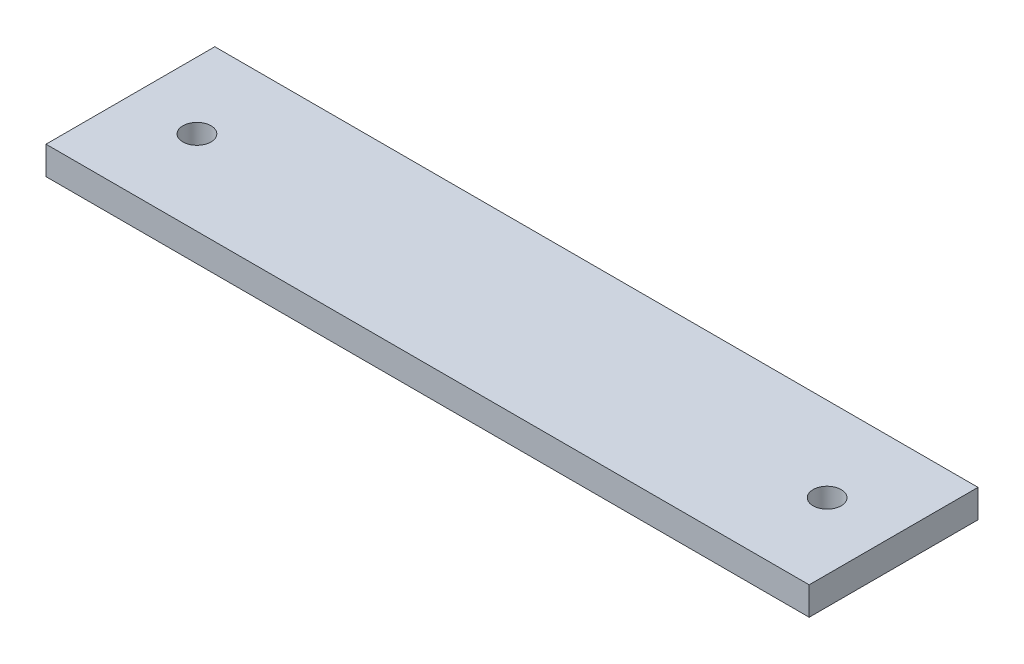
ISO-10303-21;
HEADER;
FILE_DESCRIPTION(('STEP AP214'),'2;1');
FILE_NAME('part.step','',(''),(''),'','','');
FILE_SCHEMA(('AUTOMOTIVE_DESIGN { 1 0 10303 214 1 1 1 1 }'));
ENDSEC;
DATA;
#1=APPLICATION_CONTEXT('core data for automotive mechanical design processes');
#2=APPLICATION_PROTOCOL_DEFINITION('international standard','automotive_design',2000,#1);
#3=PRODUCT_CONTEXT('',#1,'mechanical');
#4=PRODUCT('Part','Part','',(#3));
#5=PRODUCT_RELATED_PRODUCT_CATEGORY('part','',(#4));
#6=PRODUCT_DEFINITION_FORMATION('','',#4);
#7=PRODUCT_DEFINITION_CONTEXT('part definition',#1,'design');
#8=PRODUCT_DEFINITION('design','',#6,#7);
#9=PRODUCT_DEFINITION_SHAPE('','',#8);
#10=(LENGTH_UNIT() NAMED_UNIT(*) SI_UNIT(.MILLI.,.METRE.));
#11=(NAMED_UNIT(*) PLANE_ANGLE_UNIT() SI_UNIT($,.RADIAN.));
#12=(NAMED_UNIT(*) SI_UNIT($,.STERADIAN.) SOLID_ANGLE_UNIT());
#13=UNCERTAINTY_MEASURE_WITH_UNIT(LENGTH_MEASURE(1.E-05),#10,'distance_accuracy_value','');
#14=(GEOMETRIC_REPRESENTATION_CONTEXT(3) GLOBAL_UNCERTAINTY_ASSIGNED_CONTEXT((#13)) GLOBAL_UNIT_ASSIGNED_CONTEXT((#10,
#11,#12)) REPRESENTATION_CONTEXT('',''));
#15=CARTESIAN_POINT('',(0.,0.,0.));
#16=DIRECTION('',(0.,0.,1.));
#17=DIRECTION('',(1.,0.,0.));
#18=AXIS2_PLACEMENT_3D('',#15,#16,#17);
#19=CARTESIAN_POINT('',(86.11997,6.35,-19.05));
#20=DIRECTION('',(-1.,0.,0.));
#21=DIRECTION('',(0.,0.,1.));
#22=AXIS2_PLACEMENT_3D('',#19,#20,#21);
#23=PLANE('',#22);
#24=DIRECTION('',(0.,0.,-1.));
#25=VECTOR('',#24,1.);
#26=CARTESIAN_POINT('',(86.11997,0.,-19.05));
#27=LINE('',#26,#25);
#28=CARTESIAN_POINT('',(86.11997,0.,19.05));
#29=VERTEX_POINT('',#28);
#30=CARTESIAN_POINT('',(86.11997,0.,-19.05));
#31=VERTEX_POINT('',#30);
#32=EDGE_CURVE('E96',#29,#31,#27,.T.);
#33=ORIENTED_EDGE('',*,*,#32,.T.);
#34=DIRECTION('',(0.,-1.,0.));
#35=VECTOR('',#34,1.);
#36=CARTESIAN_POINT('',(86.11997,6.35,-19.05));
#37=LINE('',#36,#35);
#38=CARTESIAN_POINT('',(86.11997,6.35,-19.05));
#39=VERTEX_POINT('',#38);
#40=EDGE_CURVE('E11',#39,#31,#37,.T.);
#41=ORIENTED_EDGE('',*,*,#40,.F.);
#42=DIRECTION('',(0.,0.,-1.));
#43=VECTOR('',#42,1.);
#44=CARTESIAN_POINT('',(86.11997,6.35,-19.05));
#45=LINE('',#44,#43);
#46=CARTESIAN_POINT('',(86.11997,6.35,19.05));
#47=VERTEX_POINT('',#46);
#48=EDGE_CURVE('E84',#47,#39,#45,.T.);
#49=ORIENTED_EDGE('',*,*,#48,.F.);
#50=DIRECTION('',(0.,-1.,0.));
#51=VECTOR('',#50,1.);
#52=CARTESIAN_POINT('',(86.11997,6.35,19.05));
#53=LINE('',#52,#51);
#54=EDGE_CURVE('E92',#47,#29,#53,.T.);
#55=ORIENTED_EDGE('',*,*,#54,.T.);
#56=EDGE_LOOP('',(#33,#41,#49,#55));
#57=FACE_BOUND('',#56,.T.);
#58=ADVANCED_FACE('F33',(#57),#23,.F.);
#59=CARTESIAN_POINT('',(-86.11997,6.35,-19.05));
#60=DIRECTION('',(0.,0.,1.));
#61=DIRECTION('',(1.,0.,0.));
#62=AXIS2_PLACEMENT_3D('',#59,#60,#61);
#63=PLANE('',#62);
#64=DIRECTION('',(-1.,0.,0.));
#65=VECTOR('',#64,1.);
#66=CARTESIAN_POINT('',(-86.11997,0.,-19.05));
#67=LINE('',#66,#65);
#68=CARTESIAN_POINT('',(-86.11997,0.,-19.05));
#69=VERTEX_POINT('',#68);
#70=EDGE_CURVE('E88',#31,#69,#67,.T.);
#71=ORIENTED_EDGE('',*,*,#70,.T.);
#72=DIRECTION('',(0.,-1.,0.));
#73=VECTOR('',#72,1.);
#74=CARTESIAN_POINT('',(-86.11997,6.35,-19.05));
#75=LINE('',#74,#73);
#76=CARTESIAN_POINT('',(-86.11997,6.35,-19.05));
#77=VERTEX_POINT('',#76);
#78=EDGE_CURVE('E41',#77,#69,#75,.T.);
#79=ORIENTED_EDGE('',*,*,#78,.F.);
#80=DIRECTION('',(-1.,0.,0.));
#81=VECTOR('',#80,1.);
#82=CARTESIAN_POINT('',(-86.11997,6.35,-19.05));
#83=LINE('',#82,#81);
#84=EDGE_CURVE('E79',#39,#77,#83,.T.);
#85=ORIENTED_EDGE('',*,*,#84,.F.);
#86=ORIENTED_EDGE('',*,*,#40,.T.);
#87=EDGE_LOOP('',(#71,#79,#85,#86));
#88=FACE_BOUND('',#87,.T.);
#89=ADVANCED_FACE('F87',(#88),#63,.F.);
#90=CARTESIAN_POINT('',(-86.11997,6.35,-19.05));
#91=DIRECTION('',(1.,0.,0.));
#92=DIRECTION('',(0.,0.,-1.));
#93=AXIS2_PLACEMENT_3D('',#90,#91,#92);
#94=PLANE('',#93);
#95=DIRECTION('',(0.,0.,1.));
#96=VECTOR('',#95,1.);
#97=CARTESIAN_POINT('',(-86.11997,0.,-19.05));
#98=LINE('',#97,#96);
#99=CARTESIAN_POINT('',(-86.11997,0.,19.05));
#100=VERTEX_POINT('',#99);
#101=EDGE_CURVE('E66',#69,#100,#98,.T.);
#102=ORIENTED_EDGE('',*,*,#101,.T.);
#103=DIRECTION('',(0.,-1.,0.));
#104=VECTOR('',#103,1.);
#105=CARTESIAN_POINT('',(-86.11997,6.35,19.05));
#106=LINE('',#105,#104);
#107=CARTESIAN_POINT('',(-86.11997,6.35,19.05));
#108=VERTEX_POINT('',#107);
#109=EDGE_CURVE('E89',#108,#100,#106,.T.);
#110=ORIENTED_EDGE('',*,*,#109,.F.);
#111=DIRECTION('',(0.,0.,1.));
#112=VECTOR('',#111,1.);
#113=CARTESIAN_POINT('',(-86.11997,6.35,-19.05));
#114=LINE('',#113,#112);
#115=EDGE_CURVE('E82',#77,#108,#114,.T.);
#116=ORIENTED_EDGE('',*,*,#115,.F.);
#117=ORIENTED_EDGE('',*,*,#78,.T.);
#118=EDGE_LOOP('',(#102,#110,#116,#117));
#119=FACE_BOUND('',#118,.T.);
#120=ADVANCED_FACE('F90',(#119),#94,.F.);
#121=CARTESIAN_POINT('',(-86.11997,6.35,19.05));
#122=DIRECTION('',(0.,0.,-1.));
#123=DIRECTION('',(-1.,0.,0.));
#124=AXIS2_PLACEMENT_3D('',#121,#122,#123);
#125=PLANE('',#124);
#126=DIRECTION('',(1.,0.,0.));
#127=VECTOR('',#126,1.);
#128=CARTESIAN_POINT('',(-86.11997,0.,19.05));
#129=LINE('',#128,#127);
#130=EDGE_CURVE('E72',#100,#29,#129,.T.);
#131=ORIENTED_EDGE('',*,*,#130,.T.);
#132=ORIENTED_EDGE('',*,*,#54,.F.);
#133=DIRECTION('',(1.,0.,0.));
#134=VECTOR('',#133,1.);
#135=CARTESIAN_POINT('',(-86.11997,6.35,19.05));
#136=LINE('',#135,#134);
#137=EDGE_CURVE('E49',#108,#47,#136,.T.);
#138=ORIENTED_EDGE('',*,*,#137,.F.);
#139=ORIENTED_EDGE('',*,*,#109,.T.);
#140=EDGE_LOOP('',(#131,#132,#138,#139));
#141=FACE_BOUND('',#140,.T.);
#142=ADVANCED_FACE('F104',(#141),#125,.F.);
#143=CARTESIAN_POINT('',(0.,6.35,0.));
#144=DIRECTION('',(0.,1.,0.));
#145=DIRECTION('',(0.,0.,1.));
#146=AXIS2_PLACEMENT_3D('',#143,#144,#145);
#147=PLANE('',#146);
#148=CARTESIAN_POINT('',(71.11997,6.35,0.));
#149=DIRECTION('',(0.,1.,0.));
#150=DIRECTION('',(0.,0.,1.));
#151=AXIS2_PLACEMENT_3D('',#148,#149,#150);
#152=CIRCLE('',#151,3.175);
#153=CARTESIAN_POINT('',(71.11997,6.35,3.175));
#154=VERTEX_POINT('',#153);
#155=EDGE_CURVE('E116',#154,#154,#152,.F.);
#156=ORIENTED_EDGE('',*,*,#155,.T.);
#157=EDGE_LOOP('',(#156));
#158=FACE_BOUND('',#157,.T.);
#159=CARTESIAN_POINT('',(-71.10857,6.35,0.));
#160=DIRECTION('',(0.,1.,0.));
#161=DIRECTION('',(0.,0.,1.));
#162=AXIS2_PLACEMENT_3D('',#159,#160,#161);
#163=CIRCLE('',#162,3.175);
#164=CARTESIAN_POINT('',(-71.10857,6.35,3.175));
#165=VERTEX_POINT('',#164);
#166=EDGE_CURVE('E110',#165,#165,#163,.F.);
#167=ORIENTED_EDGE('',*,*,#166,.T.);
#168=EDGE_LOOP('',(#167));
#169=FACE_BOUND('',#168,.T.);
#170=ORIENTED_EDGE('',*,*,#48,.T.);
#171=ORIENTED_EDGE('',*,*,#84,.T.);
#172=ORIENTED_EDGE('',*,*,#115,.T.);
#173=ORIENTED_EDGE('',*,*,#137,.T.);
#174=EDGE_LOOP('',(#170,#171,#172,#173));
#175=FACE_BOUND('',#174,.T.);
#176=ADVANCED_FACE('F80',(#158,#169,#175),#147,.T.);
#177=CARTESIAN_POINT('',(0.,0.,0.));
#178=DIRECTION('',(0.,1.,0.));
#179=DIRECTION('',(0.,0.,1.));
#180=AXIS2_PLACEMENT_3D('',#177,#178,#179);
#181=PLANE('',#180);
#182=CARTESIAN_POINT('',(71.11997,0.,0.));
#183=DIRECTION('',(0.,-1.,0.));
#184=DIRECTION('',(0.,0.,-1.));
#185=AXIS2_PLACEMENT_3D('',#182,#183,#184);
#186=CIRCLE('',#185,3.175);
#187=CARTESIAN_POINT('',(71.11997,0.,-3.175));
#188=VERTEX_POINT('',#187);
#189=EDGE_CURVE('E113',#188,#188,#186,.T.);
#190=ORIENTED_EDGE('',*,*,#189,.F.);
#191=EDGE_LOOP('',(#190));
#192=FACE_BOUND('',#191,.T.);
#193=CARTESIAN_POINT('',(-71.10857,0.,0.));
#194=DIRECTION('',(0.,-1.,0.));
#195=DIRECTION('',(0.,0.,-1.));
#196=AXIS2_PLACEMENT_3D('',#193,#194,#195);
#197=CIRCLE('',#196,3.175);
#198=CARTESIAN_POINT('',(-71.10857,0.,-3.175));
#199=VERTEX_POINT('',#198);
#200=EDGE_CURVE('E99',#199,#199,#197,.T.);
#201=ORIENTED_EDGE('',*,*,#200,.F.);
#202=EDGE_LOOP('',(#201));
#203=FACE_BOUND('',#202,.T.);
#204=ORIENTED_EDGE('',*,*,#32,.F.);
#205=ORIENTED_EDGE('',*,*,#130,.F.);
#206=ORIENTED_EDGE('',*,*,#101,.F.);
#207=ORIENTED_EDGE('',*,*,#70,.F.);
#208=EDGE_LOOP('',(#204,#205,#206,#207));
#209=FACE_BOUND('',#208,.T.);
#210=ADVANCED_FACE('F107',(#192,#203,#209),#181,.F.);
#211=CARTESIAN_POINT('',(-71.10857,6.351,0.));
#212=DIRECTION('',(0.,-1.,0.));
#213=DIRECTION('',(0.,0.,-1.));
#214=AXIS2_PLACEMENT_3D('',#211,#212,#213);
#215=CYLINDRICAL_SURFACE('',#214,3.175);
#216=ORIENTED_EDGE('',*,*,#166,.F.);
#217=EDGE_LOOP('',(#216));
#218=FACE_BOUND('',#217,.T.);
#219=ORIENTED_EDGE('',*,*,#200,.T.);
#220=EDGE_LOOP('',(#219));
#221=FACE_BOUND('',#220,.T.);
#222=ADVANCED_FACE('F126',(#218,#221),#215,.F.);
#223=CARTESIAN_POINT('',(71.11997,6.351,0.));
#224=DIRECTION('',(0.,-1.,0.));
#225=DIRECTION('',(0.,0.,-1.));
#226=AXIS2_PLACEMENT_3D('',#223,#224,#225);
#227=CYLINDRICAL_SURFACE('',#226,3.175);
#228=ORIENTED_EDGE('',*,*,#155,.F.);
#229=EDGE_LOOP('',(#228));
#230=FACE_BOUND('',#229,.T.);
#231=ORIENTED_EDGE('',*,*,#189,.T.);
#232=EDGE_LOOP('',(#231));
#233=FACE_BOUND('',#232,.T.);
#234=ADVANCED_FACE('F122',(#230,#233),#227,.F.);
#235=CLOSED_SHELL('',(#58,#89,#120,#142,#176,#210,#222,#234));
#236=MANIFOLD_SOLID_BREP('B2',#235);
#237=ADVANCED_BREP_SHAPE_REPRESENTATION('',(#18,#236),#14);
#238=SHAPE_DEFINITION_REPRESENTATION(#9,#237);
ENDSEC;
END-ISO-10303-21;
